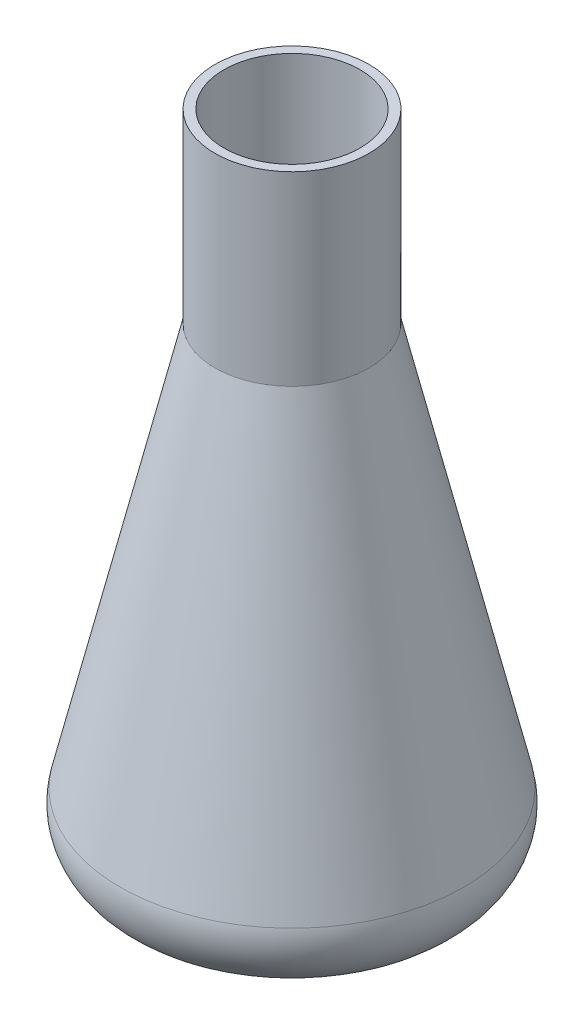
ISO-10303-21;
HEADER;
FILE_DESCRIPTION(('STEP AP214'),'2;1');
FILE_NAME('part.step','',(''),(''),'','','');
FILE_SCHEMA(('AUTOMOTIVE_DESIGN { 1 0 10303 214 1 1 1 1 }'));
ENDSEC;
DATA;
#1=APPLICATION_CONTEXT('core data for automotive mechanical design processes');
#2=APPLICATION_PROTOCOL_DEFINITION('international standard','automotive_design',2000,#1);
#3=PRODUCT_CONTEXT('',#1,'mechanical');
#4=PRODUCT('Part','Part','',(#3));
#5=PRODUCT_RELATED_PRODUCT_CATEGORY('part','',(#4));
#6=PRODUCT_DEFINITION_FORMATION('','',#4);
#7=PRODUCT_DEFINITION_CONTEXT('part definition',#1,'design');
#8=PRODUCT_DEFINITION('design','',#6,#7);
#9=PRODUCT_DEFINITION_SHAPE('','',#8);
#10=(LENGTH_UNIT() NAMED_UNIT(*) SI_UNIT(.MILLI.,.METRE.));
#11=(NAMED_UNIT(*) PLANE_ANGLE_UNIT() SI_UNIT($,.RADIAN.));
#12=(NAMED_UNIT(*) SI_UNIT($,.STERADIAN.) SOLID_ANGLE_UNIT());
#13=UNCERTAINTY_MEASURE_WITH_UNIT(LENGTH_MEASURE(1.E-05),#10,'distance_accuracy_value','');
#14=(GEOMETRIC_REPRESENTATION_CONTEXT(3) GLOBAL_UNCERTAINTY_ASSIGNED_CONTEXT((#13)) GLOBAL_UNIT_ASSIGNED_CONTEXT((#10,
#11,#12)) REPRESENTATION_CONTEXT('',''));
#15=CARTESIAN_POINT('',(0.,0.,0.));
#16=DIRECTION('',(0.,0.,1.));
#17=DIRECTION('',(1.,0.,0.));
#18=AXIS2_PLACEMENT_3D('',#15,#16,#17);
#19=CARTESIAN_POINT('',(24.2251627210355,2.,0.));
#20=DIRECTION('',(0.,1.,0.));
#21=DIRECTION('',(0.,0.,1.));
#22=AXIS2_PLACEMENT_3D('',#19,#20,#21);
#23=PLANE('',#22);
#24=CARTESIAN_POINT('',(0.,2.00000000000001,0.));
#25=DIRECTION('',(0.,-1.,0.));
#26=DIRECTION('',(0.,0.,-1.));
#27=AXIS2_PLACEMENT_3D('',#24,#25,#26);
#28=CIRCLE('',#27,24.2251627210355);
#29=CARTESIAN_POINT('',(0.,2.00000000000001,-24.2251627210355));
#30=VERTEX_POINT('',#29);
#31=EDGE_CURVE('E10',#30,#30,#28,.T.);
#32=ORIENTED_EDGE('',*,*,#31,.F.);
#33=EDGE_LOOP('',(#32));
#34=FACE_BOUND('',#33,.T.);
#35=ADVANCED_FACE('F30',(#34),#23,.T.);
#36=CARTESIAN_POINT('',(0.,13.6781585224315,0.));
#37=DIRECTION('',(0.,-1.,0.));
#38=DIRECTION('',(0.,0.,-1.));
#39=AXIS2_PLACEMENT_3D('',#36,#37,#38);
#40=TOROIDAL_SURFACE('',#39,24.2251627210355,11.6781585224315);
#41=ORIENTED_EDGE('',*,*,#31,.T.);
#42=EDGE_LOOP('',(#41));
#43=FACE_BOUND('',#42,.T.);
#44=CARTESIAN_POINT('',(0.,16.3559620862809,0.));
#45=DIRECTION('',(0.,-1.,0.));
#46=DIRECTION('',(0.,0.,-1.));
#47=AXIS2_PLACEMENT_3D('',#44,#45,#46);
#48=CIRCLE('',#47,35.5921656043146);
#49=CARTESIAN_POINT('',(0.,16.3559620862809,-35.5921656043146));
#50=VERTEX_POINT('',#49);
#51=EDGE_CURVE('E36',#50,#50,#48,.T.);
#52=ORIENTED_EDGE('',*,*,#51,.F.);
#53=EDGE_LOOP('',(#52));
#54=FACE_BOUND('',#53,.T.);
#55=ADVANCED_FACE('F78',(#43,#54),#40,.F.);
#56=CARTESIAN_POINT('',(0.,103.767603835208,0.));
#57=DIRECTION('',(0.,-1.,0.));
#58=DIRECTION('',(0.,0.,-1.));
#59=AXIS2_PLACEMENT_3D('',#56,#57,#58);
#60=CONICAL_SURFACE('',#59,15.,0.231358620029784);
#61=ORIENTED_EDGE('',*,*,#51,.T.);
#62=EDGE_LOOP('',(#61));
#63=FACE_BOUND('',#62,.T.);
#64=CARTESIAN_POINT('',(0.,103.767603835208,0.));
#65=DIRECTION('',(0.,-1.,0.));
#66=DIRECTION('',(0.,0.,-1.));
#67=AXIS2_PLACEMENT_3D('',#64,#65,#66);
#68=CIRCLE('',#67,15.);
#69=CARTESIAN_POINT('',(0.,103.767603835208,-15.));
#70=VERTEX_POINT('',#69);
#71=EDGE_CURVE('E40',#70,#70,#68,.T.);
#72=ORIENTED_EDGE('',*,*,#71,.F.);
#73=EDGE_LOOP('',(#72));
#74=FACE_BOUND('',#73,.T.);
#75=ADVANCED_FACE('F83',(#63,#74),#60,.F.);
#76=CARTESIAN_POINT('',(0.,0.,0.));
#77=DIRECTION('',(0.,-1.,0.));
#78=DIRECTION('',(0.,0.,-1.));
#79=AXIS2_PLACEMENT_3D('',#76,#77,#78);
#80=CYLINDRICAL_SURFACE('',#79,15.);
#81=ORIENTED_EDGE('',*,*,#71,.T.);
#82=EDGE_LOOP('',(#81));
#83=FACE_BOUND('',#82,.T.);
#84=CARTESIAN_POINT('',(0.,145.,0.));
#85=DIRECTION('',(0.,-1.,0.));
#86=DIRECTION('',(0.,0.,-1.));
#87=AXIS2_PLACEMENT_3D('',#84,#85,#86);
#88=CIRCLE('',#87,15.);
#89=CARTESIAN_POINT('',(0.,145.,-15.));
#90=VERTEX_POINT('',#89);
#91=EDGE_CURVE('E44',#90,#90,#88,.T.);
#92=ORIENTED_EDGE('',*,*,#91,.F.);
#93=EDGE_LOOP('',(#92));
#94=FACE_BOUND('',#93,.T.);
#95=ADVANCED_FACE('F87',(#83,#94),#80,.F.);
#96=CARTESIAN_POINT('',(17.,145.,0.));
#97=DIRECTION('',(0.,1.,0.));
#98=DIRECTION('',(0.,0.,1.));
#99=AXIS2_PLACEMENT_3D('',#96,#97,#98);
#100=PLANE('',#99);
#101=ORIENTED_EDGE('',*,*,#91,.T.);
#102=EDGE_LOOP('',(#101));
#103=FACE_BOUND('',#102,.T.);
#104=CARTESIAN_POINT('',(0.,145.,0.));
#105=DIRECTION('',(0.,-1.,0.));
#106=DIRECTION('',(0.,0.,-1.));
#107=AXIS2_PLACEMENT_3D('',#104,#105,#106);
#108=CIRCLE('',#107,17.);
#109=CARTESIAN_POINT('',(0.,145.,-17.));
#110=VERTEX_POINT('',#109);
#111=EDGE_CURVE('E49',#110,#110,#108,.T.);
#112=ORIENTED_EDGE('',*,*,#111,.F.);
#113=EDGE_LOOP('',(#112));
#114=FACE_BOUND('',#113,.T.);
#115=ADVANCED_FACE('F93',(#103,#114),#100,.T.);
#116=CARTESIAN_POINT('',(0.,0.,0.));
#117=DIRECTION('',(0.,-1.,0.));
#118=DIRECTION('',(0.,0.,-1.));
#119=AXIS2_PLACEMENT_3D('',#116,#117,#118);
#120=CYLINDRICAL_SURFACE('',#119,17.);
#121=ORIENTED_EDGE('',*,*,#111,.T.);
#122=EDGE_LOOP('',(#121));
#123=FACE_BOUND('',#122,.T.);
#124=CARTESIAN_POINT('',(0.,104.,0.));
#125=DIRECTION('',(0.,-1.,0.));
#126=DIRECTION('',(0.,0.,-1.));
#127=AXIS2_PLACEMENT_3D('',#124,#125,#126);
#128=CIRCLE('',#127,17.);
#129=CARTESIAN_POINT('',(0.,104.,-17.));
#130=VERTEX_POINT('',#129);
#131=EDGE_CURVE('E52',#130,#130,#128,.T.);
#132=ORIENTED_EDGE('',*,*,#131,.F.);
#133=EDGE_LOOP('',(#132));
#134=FACE_BOUND('',#133,.T.);
#135=ADVANCED_FACE('F74',(#123,#134),#120,.T.);
#136=CARTESIAN_POINT('',(0.,15.2883479154997,0.));
#137=DIRECTION('',(0.,-1.,0.));
#138=DIRECTION('',(0.,0.,-1.));
#139=AXIS2_PLACEMENT_3D('',#136,#137,#138);
#140=CONICAL_SURFACE('',#139,37.8984180391371,0.231358620029784);
#141=ORIENTED_EDGE('',*,*,#131,.T.);
#142=EDGE_LOOP('',(#141));
#143=FACE_BOUND('',#142,.T.);
#144=CARTESIAN_POINT('',(0.,15.2883479154997,0.));
#145=DIRECTION('',(0.,-1.,0.));
#146=DIRECTION('',(0.,0.,-1.));
#147=AXIS2_PLACEMENT_3D('',#144,#145,#146);
#148=CIRCLE('',#147,37.8984180391371);
#149=CARTESIAN_POINT('',(0.,15.2883479154997,-37.8984180391371));
#150=VERTEX_POINT('',#149);
#151=EDGE_CURVE('E55',#150,#150,#148,.T.);
#152=ORIENTED_EDGE('',*,*,#151,.F.);
#153=EDGE_LOOP('',(#152));
#154=FACE_BOUND('',#153,.T.);
#155=ADVANCED_FACE('F66',(#143,#154),#140,.T.);
#156=CARTESIAN_POINT('',(0.,12.4366273350575,0.));
#157=DIRECTION('',(0.,-1.,0.));
#158=DIRECTION('',(0.,0.,-1.));
#159=AXIS2_PLACEMENT_3D('',#156,#157,#158);
#160=TOROIDAL_SURFACE('',#159,25.7931551670561,12.4366273350575);
#161=ORIENTED_EDGE('',*,*,#151,.T.);
#162=EDGE_LOOP('',(#161));
#163=FACE_BOUND('',#162,.T.);
#164=CARTESIAN_POINT('',(0.,0.,0.));
#165=DIRECTION('',(0.,-1.,0.));
#166=DIRECTION('',(0.,0.,-1.));
#167=AXIS2_PLACEMENT_3D('',#164,#165,#166);
#168=CIRCLE('',#167,25.7931551670561);
#169=CARTESIAN_POINT('',(0.,0.,-25.7931551670561));
#170=VERTEX_POINT('',#169);
#171=EDGE_CURVE('E58',#170,#170,#168,.T.);
#172=ORIENTED_EDGE('',*,*,#171,.F.);
#173=EDGE_LOOP('',(#172));
#174=FACE_BOUND('',#173,.T.);
#175=ADVANCED_FACE('F64',(#163,#174),#160,.T.);
#176=CARTESIAN_POINT('',(0.,0.,0.));
#177=DIRECTION('',(0.,-1.,0.));
#178=DIRECTION('',(0.,0.,-1.));
#179=AXIS2_PLACEMENT_3D('',#176,#177,#178);
#180=PLANE('',#179);
#181=ORIENTED_EDGE('',*,*,#171,.T.);
#182=EDGE_LOOP('',(#181));
#183=FACE_BOUND('',#182,.T.);
#184=ADVANCED_FACE('F62',(#183),#180,.T.);
#185=CLOSED_SHELL('',(#35,#55,#75,#95,#115,#135,#155,#175,#184));
#186=MANIFOLD_SOLID_BREP('B2',#185);
#187=ADVANCED_BREP_SHAPE_REPRESENTATION('',(#18,#186),#14);
#188=SHAPE_DEFINITION_REPRESENTATION(#9,#187);
ENDSEC;
END-ISO-10303-21;
